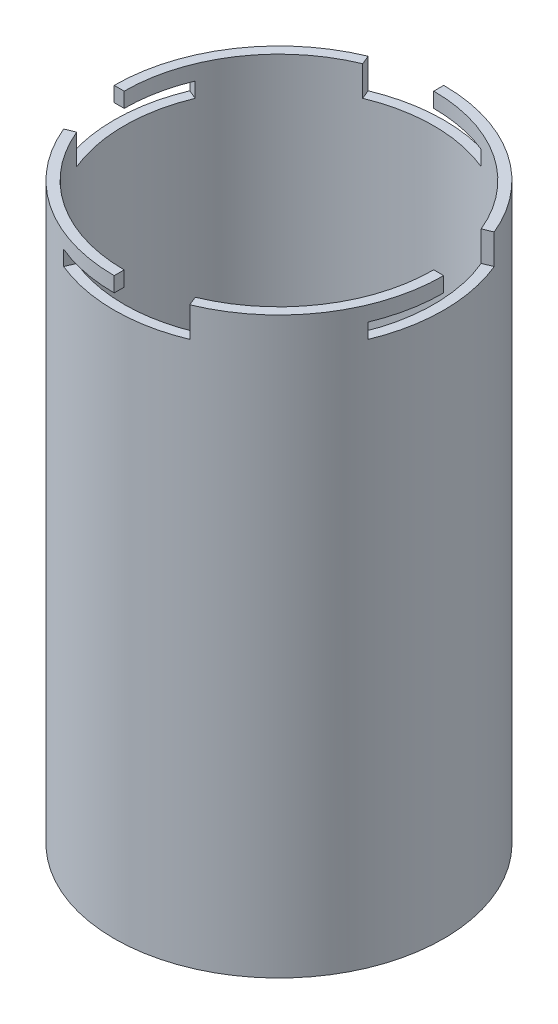
ISO-10303-21;
HEADER;
FILE_DESCRIPTION(('STEP AP214'),'2;1');
FILE_NAME('part.step','',(''),(''),'','','');
FILE_SCHEMA(('AUTOMOTIVE_DESIGN { 1 0 10303 214 1 1 1 1 }'));
ENDSEC;
DATA;
#1=APPLICATION_CONTEXT('core data for automotive mechanical design processes');
#2=APPLICATION_PROTOCOL_DEFINITION('international standard','automotive_design',2000,#1);
#3=PRODUCT_CONTEXT('',#1,'mechanical');
#4=PRODUCT('Part','Part','',(#3));
#5=PRODUCT_RELATED_PRODUCT_CATEGORY('part','',(#4));
#6=PRODUCT_DEFINITION_FORMATION('','',#4);
#7=PRODUCT_DEFINITION_CONTEXT('part definition',#1,'design');
#8=PRODUCT_DEFINITION('design','',#6,#7);
#9=PRODUCT_DEFINITION_SHAPE('','',#8);
#10=(LENGTH_UNIT() NAMED_UNIT(*) SI_UNIT(.MILLI.,.METRE.));
#11=(NAMED_UNIT(*) PLANE_ANGLE_UNIT() SI_UNIT($,.RADIAN.));
#12=(NAMED_UNIT(*) SI_UNIT($,.STERADIAN.) SOLID_ANGLE_UNIT());
#13=UNCERTAINTY_MEASURE_WITH_UNIT(LENGTH_MEASURE(1.E-05),#10,'distance_accuracy_value','');
#14=(GEOMETRIC_REPRESENTATION_CONTEXT(3) GLOBAL_UNCERTAINTY_ASSIGNED_CONTEXT((#13)) GLOBAL_UNIT_ASSIGNED_CONTEXT((#10,
#11,#12)) REPRESENTATION_CONTEXT('',''));
#15=CARTESIAN_POINT('',(0.,0.,0.));
#16=DIRECTION('',(0.,0.,1.));
#17=DIRECTION('',(1.,0.,0.));
#18=AXIS2_PLACEMENT_3D('',#15,#16,#17);
#19=CARTESIAN_POINT('',(0.,115.,0.));
#20=DIRECTION('',(0.,1.,0.));
#21=DIRECTION('',(0.,0.,1.));
#22=AXIS2_PLACEMENT_3D('',#19,#20,#21);
#23=PLANE('',#22);
#24=CARTESIAN_POINT('',(0.,115.,0.));
#25=DIRECTION('',(0.,1.,0.));
#26=DIRECTION('',(0.,0.,1.));
#27=AXIS2_PLACEMENT_3D('',#24,#25,#26);
#28=CIRCLE('',#27,31.);
#29=CARTESIAN_POINT('',(11.8631864033178,115.,28.6402655078499));
#30=VERTEX_POINT('',#29);
#31=CARTESIAN_POINT('',(31.,115.,0.));
#32=VERTEX_POINT('',#31);
#33=EDGE_CURVE('E209',#30,#32,#28,.T.);
#34=ORIENTED_EDGE('',*,*,#33,.F.);
#35=DIRECTION('',(0.38268343236509,0.,0.923879532511287));
#36=VECTOR('',#35,1.);
#37=CARTESIAN_POINT('',(0.,115.,0.));
#38=LINE('',#37,#36);
#39=CARTESIAN_POINT('',(12.628553268048,115.,30.4880245728725));
#40=VERTEX_POINT('',#39);
#41=EDGE_CURVE('E422',#30,#40,#38,.T.);
#42=ORIENTED_EDGE('',*,*,#41,.T.);
#43=CARTESIAN_POINT('',(0.,115.,0.));
#44=DIRECTION('',(0.,1.,0.));
#45=DIRECTION('',(0.,0.,1.));
#46=AXIS2_PLACEMENT_3D('',#43,#44,#45);
#47=CIRCLE('',#46,33.);
#48=CARTESIAN_POINT('',(33.,115.,0.));
#49=VERTEX_POINT('',#48);
#50=EDGE_CURVE('E424',#40,#49,#47,.T.);
#51=ORIENTED_EDGE('',*,*,#50,.T.);
#52=DIRECTION('',(1.,0.,0.));
#53=VECTOR('',#52,1.);
#54=CARTESIAN_POINT('',(0.,115.,0.));
#55=LINE('',#54,#53);
#56=EDGE_CURVE('E428',#32,#49,#55,.T.);
#57=ORIENTED_EDGE('',*,*,#56,.F.);
#58=EDGE_LOOP('',(#34,#42,#51,#57));
#59=FACE_BOUND('',#58,.T.);
#60=ADVANCED_FACE('F35',(#59),#23,.T.);
#61=CARTESIAN_POINT('',(28.6402655078499,115.,-11.8631864033178));
#62=VERTEX_POINT('',#61);
#63=CARTESIAN_POINT('',(0.,115.,-31.));
#64=VERTEX_POINT('',#63);
#65=EDGE_CURVE('E387',#62,#64,#28,.T.);
#66=ORIENTED_EDGE('',*,*,#65,.F.);
#67=DIRECTION('',(0.923879532511287,0.,-0.38268343236509));
#68=VECTOR('',#67,1.);
#69=CARTESIAN_POINT('',(0.,115.,0.));
#70=LINE('',#69,#68);
#71=CARTESIAN_POINT('',(30.4880245728725,115.,-12.628553268048));
#72=VERTEX_POINT('',#71);
#73=EDGE_CURVE('E434',#62,#72,#70,.T.);
#74=ORIENTED_EDGE('',*,*,#73,.T.);
#75=CARTESIAN_POINT('',(0.,115.,0.));
#76=DIRECTION('',(0.,1.,0.));
#77=DIRECTION('',(0.,0.,1.));
#78=AXIS2_PLACEMENT_3D('',#75,#76,#77);
#79=CIRCLE('',#78,33.);
#80=CARTESIAN_POINT('',(0.,115.,-33.));
#81=VERTEX_POINT('',#80);
#82=EDGE_CURVE('E396',#72,#81,#79,.T.);
#83=ORIENTED_EDGE('',*,*,#82,.T.);
#84=DIRECTION('',(0.,0.,1.));
#85=VECTOR('',#84,1.);
#86=CARTESIAN_POINT('',(0.,115.,0.));
#87=LINE('',#86,#85);
#88=EDGE_CURVE('E392',#81,#64,#87,.T.);
#89=ORIENTED_EDGE('',*,*,#88,.T.);
#90=EDGE_LOOP('',(#66,#74,#83,#89));
#91=FACE_BOUND('',#90,.T.);
#92=ADVANCED_FACE('F349',(#91),#23,.T.);
#93=CARTESIAN_POINT('',(-11.8631864033178,115.,-28.6402655078499));
#94=VERTEX_POINT('',#93);
#95=CARTESIAN_POINT('',(-31.,115.,0.));
#96=VERTEX_POINT('',#95);
#97=EDGE_CURVE('E207',#94,#96,#28,.T.);
#98=ORIENTED_EDGE('',*,*,#97,.F.);
#99=DIRECTION('',(-0.38268343236509,0.,-0.923879532511287));
#100=VECTOR('',#99,1.);
#101=CARTESIAN_POINT('',(0.,115.,0.));
#102=LINE('',#101,#100);
#103=CARTESIAN_POINT('',(-12.6285532680479,115.,-30.4880245728725));
#104=VERTEX_POINT('',#103);
#105=EDGE_CURVE('E382',#94,#104,#102,.T.);
#106=ORIENTED_EDGE('',*,*,#105,.T.);
#107=CARTESIAN_POINT('',(0.,115.,0.));
#108=DIRECTION('',(0.,1.,0.));
#109=DIRECTION('',(0.,0.,1.));
#110=AXIS2_PLACEMENT_3D('',#107,#108,#109);
#111=CIRCLE('',#110,33.);
#112=CARTESIAN_POINT('',(-33.,115.,0.));
#113=VERTEX_POINT('',#112);
#114=EDGE_CURVE('E391',#104,#113,#111,.T.);
#115=ORIENTED_EDGE('',*,*,#114,.T.);
#116=DIRECTION('',(1.,0.,0.));
#117=VECTOR('',#116,1.);
#118=CARTESIAN_POINT('',(0.,115.,-2.89792314614694E-13));
#119=LINE('',#118,#117);
#120=EDGE_CURVE('E385',#113,#96,#119,.T.);
#121=ORIENTED_EDGE('',*,*,#120,.T.);
#122=EDGE_LOOP('',(#98,#106,#115,#121));
#123=FACE_BOUND('',#122,.T.);
#124=ADVANCED_FACE('F355',(#123),#23,.T.);
#125=CARTESIAN_POINT('',(0.,109.,0.));
#126=DIRECTION('',(0.,1.,0.));
#127=DIRECTION('',(0.,0.,1.));
#128=AXIS2_PLACEMENT_3D('',#125,#126,#127);
#129=PLANE('',#128);
#130=CARTESIAN_POINT('',(0.,109.,0.));
#131=DIRECTION('',(0.,1.,0.));
#132=DIRECTION('',(0.,0.,1.));
#133=AXIS2_PLACEMENT_3D('',#130,#131,#132);
#134=CIRCLE('',#133,33.);
#135=CARTESIAN_POINT('',(-30.4880245728725,109.,-12.628553268048));
#136=VERTEX_POINT('',#135);
#137=CARTESIAN_POINT('',(-30.4880245728725,109.,12.628553268048));
#138=VERTEX_POINT('',#137);
#139=EDGE_CURVE('E326',#136,#138,#134,.T.);
#140=ORIENTED_EDGE('',*,*,#139,.T.);
#141=DIRECTION('',(0.923879532511287,0.,-0.38268343236509));
#142=VECTOR('',#141,1.);
#143=CARTESIAN_POINT('',(0.,109.,0.));
#144=LINE('',#143,#142);
#145=CARTESIAN_POINT('',(-28.6402655078499,109.,11.8631864033178));
#146=VERTEX_POINT('',#145);
#147=EDGE_CURVE('E282',#138,#146,#144,.T.);
#148=ORIENTED_EDGE('',*,*,#147,.T.);
#149=CARTESIAN_POINT('',(0.,109.,0.));
#150=DIRECTION('',(0.,1.,0.));
#151=DIRECTION('',(0.,0.,1.));
#152=AXIS2_PLACEMENT_3D('',#149,#150,#151);
#153=CIRCLE('',#152,31.);
#154=CARTESIAN_POINT('',(-28.6402655078499,109.,-11.8631864033178));
#155=VERTEX_POINT('',#154);
#156=EDGE_CURVE('E264',#155,#146,#153,.T.);
#157=ORIENTED_EDGE('',*,*,#156,.F.);
#158=DIRECTION('',(0.923879532511287,0.,0.38268343236509));
#159=VECTOR('',#158,1.);
#160=CARTESIAN_POINT('',(0.,109.,0.));
#161=LINE('',#160,#159);
#162=EDGE_CURVE('E279',#136,#155,#161,.T.);
#163=ORIENTED_EDGE('',*,*,#162,.F.);
#164=EDGE_LOOP('',(#140,#148,#157,#163));
#165=FACE_BOUND('',#164,.T.);
#166=ADVANCED_FACE('F345',(#165),#129,.T.);
#167=CARTESIAN_POINT('',(12.628553268048,109.,-30.4880245728725));
#168=VERTEX_POINT('',#167);
#169=CARTESIAN_POINT('',(-12.628553268048,109.,-30.4880245728725));
#170=VERTEX_POINT('',#169);
#171=EDGE_CURVE('E44',#168,#170,#134,.T.);
#172=ORIENTED_EDGE('',*,*,#171,.T.);
#173=DIRECTION('',(0.38268343236509,0.,0.923879532511287));
#174=VECTOR('',#173,1.);
#175=CARTESIAN_POINT('',(0.,109.,0.));
#176=LINE('',#175,#174);
#177=CARTESIAN_POINT('',(-11.8631864033178,109.,-28.6402655078499));
#178=VERTEX_POINT('',#177);
#179=EDGE_CURVE('E276',#170,#178,#176,.T.);
#180=ORIENTED_EDGE('',*,*,#179,.T.);
#181=CARTESIAN_POINT('',(11.8631864033178,109.,-28.6402655078499));
#182=VERTEX_POINT('',#181);
#183=EDGE_CURVE('E275',#182,#178,#153,.T.);
#184=ORIENTED_EDGE('',*,*,#183,.F.);
#185=DIRECTION('',(0.38268343236509,0.,-0.923879532511287));
#186=VECTOR('',#185,1.);
#187=CARTESIAN_POINT('',(0.,109.,0.));
#188=LINE('',#187,#186);
#189=EDGE_CURVE('E273',#182,#168,#188,.T.);
#190=ORIENTED_EDGE('',*,*,#189,.T.);
#191=EDGE_LOOP('',(#172,#180,#184,#190));
#192=FACE_BOUND('',#191,.T.);
#193=ADVANCED_FACE('F376',(#192),#129,.T.);
#194=DIRECTION('',(0.923879532511287,0.,-0.38268343236509));
#195=VECTOR('',#194,1.);
#196=CARTESIAN_POINT('',(0.,109.,0.));
#197=LINE('',#196,#195);
#198=CARTESIAN_POINT('',(28.6402655078499,109.,-11.8631864033178));
#199=VERTEX_POINT('',#198);
#200=CARTESIAN_POINT('',(30.4880245728725,109.,-12.628553268048));
#201=VERTEX_POINT('',#200);
#202=EDGE_CURVE('E270',#199,#201,#197,.T.);
#203=ORIENTED_EDGE('',*,*,#202,.F.);
#204=CARTESIAN_POINT('',(28.6402655078499,109.,11.8631864033178));
#205=VERTEX_POINT('',#204);
#206=EDGE_CURVE('E265',#205,#199,#153,.T.);
#207=ORIENTED_EDGE('',*,*,#206,.F.);
#208=DIRECTION('',(0.923879532511287,0.,0.38268343236509));
#209=VECTOR('',#208,1.);
#210=CARTESIAN_POINT('',(0.,109.,0.));
#211=LINE('',#210,#209);
#212=CARTESIAN_POINT('',(30.4880245728725,109.,12.628553268048));
#213=VERTEX_POINT('',#212);
#214=EDGE_CURVE('E268',#205,#213,#211,.T.);
#215=ORIENTED_EDGE('',*,*,#214,.T.);
#216=EDGE_CURVE('E11',#213,#201,#134,.T.);
#217=ORIENTED_EDGE('',*,*,#216,.T.);
#218=EDGE_LOOP('',(#203,#207,#215,#217));
#219=FACE_BOUND('',#218,.T.);
#220=ADVANCED_FACE('F346',(#219),#129,.T.);
#221=CARTESIAN_POINT('',(0.,109.,0.));
#222=DIRECTION('',(0.,-1.,0.));
#223=DIRECTION('',(0.,0.,-1.));
#224=AXIS2_PLACEMENT_3D('',#221,#222,#223);
#225=CYLINDRICAL_SURFACE('',#224,33.);
#226=ORIENTED_EDGE('',*,*,#216,.F.);
#227=DIRECTION('',(0.,-1.,0.));
#228=VECTOR('',#227,1.);
#229=CARTESIAN_POINT('',(30.4880245728725,112.,12.628553268048));
#230=LINE('',#229,#228);
#231=CARTESIAN_POINT('',(30.4880245728725,112.,12.628553268048));
#232=VERTEX_POINT('',#231);
#233=EDGE_CURVE('E318',#232,#213,#230,.T.);
#234=ORIENTED_EDGE('',*,*,#233,.F.);
#235=CARTESIAN_POINT('',(0.,112.,0.));
#236=DIRECTION('',(0.,1.,0.));
#237=DIRECTION('',(0.,0.,1.));
#238=AXIS2_PLACEMENT_3D('',#235,#236,#237);
#239=CIRCLE('',#238,33.);
#240=CARTESIAN_POINT('',(33.,112.,0.));
#241=VERTEX_POINT('',#240);
#242=EDGE_CURVE('E404',#232,#241,#239,.T.);
#243=ORIENTED_EDGE('',*,*,#242,.T.);
#244=DIRECTION('',(0.,-1.,0.));
#245=VECTOR('',#244,1.);
#246=CARTESIAN_POINT('',(33.,115.,0.));
#247=LINE('',#246,#245);
#248=EDGE_CURVE('E240',#49,#241,#247,.T.);
#249=ORIENTED_EDGE('',*,*,#248,.F.);
#250=ORIENTED_EDGE('',*,*,#50,.F.);
#251=DIRECTION('',(0.,-1.,0.));
#252=VECTOR('',#251,1.);
#253=CARTESIAN_POINT('',(12.628553268048,112.,30.4880245728725));
#254=LINE('',#253,#252);
#255=CARTESIAN_POINT('',(12.628553268048,109.,30.4880245728725));
#256=VERTEX_POINT('',#255);
#257=EDGE_CURVE('E321',#40,#256,#254,.T.);
#258=ORIENTED_EDGE('',*,*,#257,.T.);
#259=CARTESIAN_POINT('',(-12.628553268048,109.,30.4880245728725));
#260=VERTEX_POINT('',#259);
#261=EDGE_CURVE('E45',#260,#256,#134,.T.);
#262=ORIENTED_EDGE('',*,*,#261,.F.);
#263=DIRECTION('',(0.,-1.,0.));
#264=VECTOR('',#263,1.);
#265=CARTESIAN_POINT('',(-12.628553268048,112.,30.4880245728725));
#266=LINE('',#265,#264);
#267=CARTESIAN_POINT('',(-12.628553268048,112.,30.4880245728725));
#268=VERTEX_POINT('',#267);
#269=EDGE_CURVE('E287',#268,#260,#266,.T.);
#270=ORIENTED_EDGE('',*,*,#269,.F.);
#271=CARTESIAN_POINT('',(0.,112.,0.));
#272=DIRECTION('',(0.,1.,0.));
#273=DIRECTION('',(0.,0.,1.));
#274=AXIS2_PLACEMENT_3D('',#271,#272,#273);
#275=CIRCLE('',#274,33.);
#276=CARTESIAN_POINT('',(0.,112.,33.));
#277=VERTEX_POINT('',#276);
#278=EDGE_CURVE('E419',#268,#277,#275,.T.);
#279=ORIENTED_EDGE('',*,*,#278,.T.);
#280=DIRECTION('',(0.,-1.,0.));
#281=VECTOR('',#280,1.);
#282=CARTESIAN_POINT('',(0.,115.,33.));
#283=LINE('',#282,#281);
#284=CARTESIAN_POINT('',(0.,115.,33.));
#285=VERTEX_POINT('',#284);
#286=EDGE_CURVE('E223',#285,#277,#283,.T.);
#287=ORIENTED_EDGE('',*,*,#286,.F.);
#288=CARTESIAN_POINT('',(0.,115.,0.));
#289=DIRECTION('',(0.,1.,0.));
#290=DIRECTION('',(0.,0.,1.));
#291=AXIS2_PLACEMENT_3D('',#288,#289,#290);
#292=CIRCLE('',#291,33.);
#293=CARTESIAN_POINT('',(-30.4880245728725,115.,12.628553268048));
#294=VERTEX_POINT('',#293);
#295=EDGE_CURVE('E214',#294,#285,#292,.T.);
#296=ORIENTED_EDGE('',*,*,#295,.F.);
#297=DIRECTION('',(0.,-1.,0.));
#298=VECTOR('',#297,1.);
#299=CARTESIAN_POINT('',(-30.4880245728725,112.,12.628553268048));
#300=LINE('',#299,#298);
#301=EDGE_CURVE('E290',#294,#138,#300,.T.);
#302=ORIENTED_EDGE('',*,*,#301,.T.);
#303=ORIENTED_EDGE('',*,*,#139,.F.);
#304=DIRECTION('',(0.,-1.,0.));
#305=VECTOR('',#304,1.);
#306=CARTESIAN_POINT('',(-30.4880245728725,112.,-12.628553268048));
#307=LINE('',#306,#305);
#308=CARTESIAN_POINT('',(-30.4880245728725,112.,-12.628553268048));
#309=VERTEX_POINT('',#308);
#310=EDGE_CURVE('E296',#309,#136,#307,.T.);
#311=ORIENTED_EDGE('',*,*,#310,.F.);
#312=CARTESIAN_POINT('',(0.,112.,0.));
#313=DIRECTION('',(0.,1.,0.));
#314=DIRECTION('',(0.,0.,1.));
#315=AXIS2_PLACEMENT_3D('',#312,#313,#314);
#316=CIRCLE('',#315,33.);
#317=CARTESIAN_POINT('',(-33.,112.,0.));
#318=VERTEX_POINT('',#317);
#319=EDGE_CURVE('E415',#309,#318,#316,.T.);
#320=ORIENTED_EDGE('',*,*,#319,.T.);
#321=DIRECTION('',(0.,-1.,0.));
#322=VECTOR('',#321,1.);
#323=CARTESIAN_POINT('',(-33.,115.,0.));
#324=LINE('',#323,#322);
#325=EDGE_CURVE('E231',#113,#318,#324,.T.);
#326=ORIENTED_EDGE('',*,*,#325,.F.);
#327=ORIENTED_EDGE('',*,*,#114,.F.);
#328=DIRECTION('',(0.,-1.,0.));
#329=VECTOR('',#328,1.);
#330=CARTESIAN_POINT('',(-12.628553268048,112.,-30.4880245728725));
#331=LINE('',#330,#329);
#332=EDGE_CURVE('E299',#104,#170,#331,.T.);
#333=ORIENTED_EDGE('',*,*,#332,.T.);
#334=ORIENTED_EDGE('',*,*,#171,.F.);
#335=DIRECTION('',(0.,-1.,0.));
#336=VECTOR('',#335,1.);
#337=CARTESIAN_POINT('',(12.628553268048,112.,-30.4880245728725));
#338=LINE('',#337,#336);
#339=CARTESIAN_POINT('',(12.628553268048,112.,-30.4880245728725));
#340=VERTEX_POINT('',#339);
#341=EDGE_CURVE('E307',#340,#168,#338,.T.);
#342=ORIENTED_EDGE('',*,*,#341,.F.);
#343=CARTESIAN_POINT('',(0.,112.,0.));
#344=DIRECTION('',(0.,1.,0.));
#345=DIRECTION('',(0.,0.,1.));
#346=AXIS2_PLACEMENT_3D('',#343,#344,#345);
#347=CIRCLE('',#346,33.);
#348=CARTESIAN_POINT('',(0.,112.,-33.));
#349=VERTEX_POINT('',#348);
#350=EDGE_CURVE('E410',#340,#349,#347,.T.);
#351=ORIENTED_EDGE('',*,*,#350,.T.);
#352=DIRECTION('',(0.,-1.,0.));
#353=VECTOR('',#352,1.);
#354=CARTESIAN_POINT('',(0.,115.,-33.));
#355=LINE('',#354,#353);
#356=EDGE_CURVE('E235',#81,#349,#355,.T.);
#357=ORIENTED_EDGE('',*,*,#356,.F.);
#358=ORIENTED_EDGE('',*,*,#82,.F.);
#359=DIRECTION('',(0.,-1.,0.));
#360=VECTOR('',#359,1.);
#361=CARTESIAN_POINT('',(30.4880245728725,112.,-12.628553268048));
#362=LINE('',#361,#360);
#363=EDGE_CURVE('E310',#72,#201,#362,.T.);
#364=ORIENTED_EDGE('',*,*,#363,.T.);
#365=EDGE_LOOP('',(#226,#234,#243,#249,#250,#258,#262,#270,#279,#287,#296,#302,#303,#311,#320,
#326,#327,#333,#334,#342,#351,#357,#358,#364));
#366=FACE_BOUND('',#365,.T.);
#367=CARTESIAN_POINT('',(0.,0.,0.));
#368=DIRECTION('',(0.,1.,0.));
#369=DIRECTION('',(0.,0.,1.));
#370=AXIS2_PLACEMENT_3D('',#367,#368,#369);
#371=CIRCLE('',#370,33.);
#372=CARTESIAN_POINT('',(0.,0.,33.));
#373=VERTEX_POINT('',#372);
#374=EDGE_CURVE('E39',#373,#373,#371,.T.);
#375=ORIENTED_EDGE('',*,*,#374,.T.);
#376=EDGE_LOOP('',(#375));
#377=FACE_BOUND('',#376,.T.);
#378=ADVANCED_FACE('F37',(#366,#377),#225,.T.);
#379=DIRECTION('',(0.38268343236509,0.,-0.923879532511287));
#380=VECTOR('',#379,1.);
#381=CARTESIAN_POINT('',(0.,109.,0.));
#382=LINE('',#381,#380);
#383=CARTESIAN_POINT('',(-11.8631864033178,109.,28.6402655078499));
#384=VERTEX_POINT('',#383);
#385=EDGE_CURVE('E60',#260,#384,#382,.T.);
#386=ORIENTED_EDGE('',*,*,#385,.F.);
#387=ORIENTED_EDGE('',*,*,#261,.T.);
#388=DIRECTION('',(0.38268343236509,0.,0.923879532511287));
#389=VECTOR('',#388,1.);
#390=CARTESIAN_POINT('',(0.,109.,0.));
#391=LINE('',#390,#389);
#392=CARTESIAN_POINT('',(11.8631864033178,109.,28.6402655078499));
#393=VERTEX_POINT('',#392);
#394=EDGE_CURVE('E263',#393,#256,#391,.T.);
#395=ORIENTED_EDGE('',*,*,#394,.F.);
#396=EDGE_CURVE('E243',#384,#393,#153,.T.);
#397=ORIENTED_EDGE('',*,*,#396,.F.);
#398=EDGE_LOOP('',(#386,#387,#395,#397));
#399=FACE_BOUND('',#398,.T.);
#400=ADVANCED_FACE('F335',(#399),#129,.T.);
#401=CARTESIAN_POINT('',(0.,0.,0.));
#402=DIRECTION('',(0.,1.,0.));
#403=DIRECTION('',(0.,0.,1.));
#404=AXIS2_PLACEMENT_3D('',#401,#402,#403);
#405=PLANE('',#404);
#406=CARTESIAN_POINT('',(0.,0.,0.));
#407=DIRECTION('',(0.,1.,0.));
#408=DIRECTION('',(0.,0.,1.));
#409=AXIS2_PLACEMENT_3D('',#406,#407,#408);
#410=CIRCLE('',#409,31.);
#411=CARTESIAN_POINT('',(0.,0.,31.));
#412=VERTEX_POINT('',#411);
#413=EDGE_CURVE('E407',#412,#412,#410,.T.);
#414=ORIENTED_EDGE('',*,*,#413,.T.);
#415=EDGE_LOOP('',(#414));
#416=FACE_BOUND('',#415,.T.);
#417=ORIENTED_EDGE('',*,*,#374,.F.);
#418=EDGE_LOOP('',(#417));
#419=FACE_BOUND('',#418,.T.);
#420=ADVANCED_FACE('F332',(#416,#419),#405,.F.);
#421=CARTESIAN_POINT('',(0.,112.,0.));
#422=DIRECTION('',(0.923879532511286,0.,-0.38268343236509));
#423=DIRECTION('',(-0.38268343236509,0.,-0.923879532511287));
#424=AXIS2_PLACEMENT_3D('',#421,#422,#423);
#425=PLANE('',#424);
#426=ORIENTED_EDGE('',*,*,#394,.T.);
#427=ORIENTED_EDGE('',*,*,#257,.F.);
#428=ORIENTED_EDGE('',*,*,#41,.F.);
#429=DIRECTION('',(0.,-1.,0.));
#430=VECTOR('',#429,1.);
#431=CARTESIAN_POINT('',(11.8631864033178,112.,28.6402655078499));
#432=LINE('',#431,#430);
#433=EDGE_CURVE('E324',#30,#393,#432,.T.);
#434=ORIENTED_EDGE('',*,*,#433,.T.);
#435=EDGE_LOOP('',(#426,#427,#428,#434));
#436=FACE_BOUND('',#435,.T.);
#437=ADVANCED_FACE('F334',(#436),#425,.F.);
#438=CARTESIAN_POINT('',(0.,112.,0.));
#439=DIRECTION('',(0.38268343236509,0.,-0.923879532511286));
#440=DIRECTION('',(-0.923879532511287,0.,-0.38268343236509));
#441=AXIS2_PLACEMENT_3D('',#438,#439,#440);
#442=PLANE('',#441);
#443=ORIENTED_EDGE('',*,*,#214,.F.);
#444=DIRECTION('',(0.,-1.,0.));
#445=VECTOR('',#444,1.);
#446=CARTESIAN_POINT('',(28.6402655078499,112.,11.8631864033178));
#447=LINE('',#446,#445);
#448=CARTESIAN_POINT('',(28.6402655078499,112.,11.8631864033178));
#449=VERTEX_POINT('',#448);
#450=EDGE_CURVE('E316',#449,#205,#447,.T.);
#451=ORIENTED_EDGE('',*,*,#450,.F.);
#452=DIRECTION('',(0.923879532511287,0.,0.38268343236509));
#453=VECTOR('',#452,1.);
#454=CARTESIAN_POINT('',(0.,112.,0.));
#455=LINE('',#454,#453);
#456=EDGE_CURVE('E246',#449,#232,#455,.T.);
#457=ORIENTED_EDGE('',*,*,#456,.T.);
#458=ORIENTED_EDGE('',*,*,#233,.T.);
#459=EDGE_LOOP('',(#443,#451,#457,#458));
#460=FACE_BOUND('',#459,.T.);
#461=ADVANCED_FACE('F341',(#460),#442,.T.);
#462=CARTESIAN_POINT('',(0.,112.,0.));
#463=DIRECTION('',(-0.38268343236509,0.,-0.923879532511287));
#464=DIRECTION('',(-0.923879532511287,0.,0.38268343236509));
#465=AXIS2_PLACEMENT_3D('',#462,#463,#464);
#466=PLANE('',#465);
#467=ORIENTED_EDGE('',*,*,#202,.T.);
#468=ORIENTED_EDGE('',*,*,#363,.F.);
#469=ORIENTED_EDGE('',*,*,#73,.F.);
#470=DIRECTION('',(0.,-1.,0.));
#471=VECTOR('',#470,1.);
#472=CARTESIAN_POINT('',(28.6402655078499,112.,-11.8631864033178));
#473=LINE('',#472,#471);
#474=EDGE_CURVE('E313',#62,#199,#473,.T.);
#475=ORIENTED_EDGE('',*,*,#474,.T.);
#476=EDGE_LOOP('',(#467,#468,#469,#475));
#477=FACE_BOUND('',#476,.T.);
#478=ADVANCED_FACE('F470',(#477),#466,.F.);
#479=CARTESIAN_POINT('',(0.,112.,0.));
#480=DIRECTION('',(-0.923879532511287,0.,-0.38268343236509));
#481=DIRECTION('',(-0.38268343236509,0.,0.923879532511287));
#482=AXIS2_PLACEMENT_3D('',#479,#480,#481);
#483=PLANE('',#482);
#484=ORIENTED_EDGE('',*,*,#189,.F.);
#485=DIRECTION('',(0.,-1.,0.));
#486=VECTOR('',#485,1.);
#487=CARTESIAN_POINT('',(11.8631864033178,112.,-28.6402655078499));
#488=LINE('',#487,#486);
#489=CARTESIAN_POINT('',(11.8631864033178,112.,-28.6402655078499));
#490=VERTEX_POINT('',#489);
#491=EDGE_CURVE('E305',#490,#182,#488,.T.);
#492=ORIENTED_EDGE('',*,*,#491,.F.);
#493=DIRECTION('',(0.38268343236509,0.,-0.923879532511287));
#494=VECTOR('',#493,1.);
#495=CARTESIAN_POINT('',(0.,112.,0.));
#496=LINE('',#495,#494);
#497=EDGE_CURVE('E251',#490,#340,#496,.T.);
#498=ORIENTED_EDGE('',*,*,#497,.T.);
#499=ORIENTED_EDGE('',*,*,#341,.T.);
#500=EDGE_LOOP('',(#484,#492,#498,#499));
#501=FACE_BOUND('',#500,.T.);
#502=ADVANCED_FACE('F507',(#501),#483,.T.);
#503=CARTESIAN_POINT('',(0.,112.,0.));
#504=DIRECTION('',(0.923879532511287,0.,-0.38268343236509));
#505=DIRECTION('',(-0.38268343236509,0.,-0.923879532511287));
#506=AXIS2_PLACEMENT_3D('',#503,#504,#505);
#507=PLANE('',#506);
#508=ORIENTED_EDGE('',*,*,#179,.F.);
#509=ORIENTED_EDGE('',*,*,#332,.F.);
#510=ORIENTED_EDGE('',*,*,#105,.F.);
#511=DIRECTION('',(0.,-1.,0.));
#512=VECTOR('',#511,1.);
#513=CARTESIAN_POINT('',(-11.8631864033178,112.,-28.6402655078499));
#514=LINE('',#513,#512);
#515=EDGE_CURVE('E302',#94,#178,#514,.T.);
#516=ORIENTED_EDGE('',*,*,#515,.T.);
#517=EDGE_LOOP('',(#508,#509,#510,#516));
#518=FACE_BOUND('',#517,.T.);
#519=ADVANCED_FACE('F390',(#518),#507,.T.);
#520=CARTESIAN_POINT('',(0.,112.,0.));
#521=DIRECTION('',(0.38268343236509,0.,-0.923879532511287));
#522=DIRECTION('',(-0.923879532511287,0.,-0.38268343236509));
#523=AXIS2_PLACEMENT_3D('',#520,#521,#522);
#524=PLANE('',#523);
#525=ORIENTED_EDGE('',*,*,#162,.T.);
#526=DIRECTION('',(0.,-1.,0.));
#527=VECTOR('',#526,1.);
#528=CARTESIAN_POINT('',(-28.6402655078499,112.,-11.8631864033178));
#529=LINE('',#528,#527);
#530=CARTESIAN_POINT('',(-28.6402655078499,112.,-11.8631864033178));
#531=VERTEX_POINT('',#530);
#532=EDGE_CURVE('E294',#531,#155,#529,.T.);
#533=ORIENTED_EDGE('',*,*,#532,.F.);
#534=DIRECTION('',(0.923879532511287,0.,0.38268343236509));
#535=VECTOR('',#534,1.);
#536=CARTESIAN_POINT('',(0.,112.,0.));
#537=LINE('',#536,#535);
#538=EDGE_CURVE('E255',#309,#531,#537,.T.);
#539=ORIENTED_EDGE('',*,*,#538,.F.);
#540=ORIENTED_EDGE('',*,*,#310,.T.);
#541=EDGE_LOOP('',(#525,#533,#539,#540));
#542=FACE_BOUND('',#541,.T.);
#543=ADVANCED_FACE('F460',(#542),#524,.F.);
#544=CARTESIAN_POINT('',(0.,112.,0.));
#545=DIRECTION('',(-0.38268343236509,0.,-0.923879532511287));
#546=DIRECTION('',(-0.923879532511287,0.,0.38268343236509));
#547=AXIS2_PLACEMENT_3D('',#544,#545,#546);
#548=PLANE('',#547);
#549=ORIENTED_EDGE('',*,*,#147,.F.);
#550=ORIENTED_EDGE('',*,*,#301,.F.);
#551=DIRECTION('',(-0.923879532511287,0.,0.38268343236509));
#552=VECTOR('',#551,1.);
#553=CARTESIAN_POINT('',(0.,115.,0.));
#554=LINE('',#553,#552);
#555=CARTESIAN_POINT('',(-28.6402655078499,115.,11.8631864033178));
#556=VERTEX_POINT('',#555);
#557=EDGE_CURVE('E401',#556,#294,#554,.T.);
#558=ORIENTED_EDGE('',*,*,#557,.F.);
#559=DIRECTION('',(0.,-1.,0.));
#560=VECTOR('',#559,1.);
#561=CARTESIAN_POINT('',(-28.6402655078499,112.,11.8631864033178));
#562=LINE('',#561,#560);
#563=EDGE_CURVE('E203',#556,#146,#562,.T.);
#564=ORIENTED_EDGE('',*,*,#563,.T.);
#565=EDGE_LOOP('',(#549,#550,#558,#564));
#566=FACE_BOUND('',#565,.T.);
#567=ADVANCED_FACE('F499',(#566),#548,.T.);
#568=CARTESIAN_POINT('',(0.,112.,0.));
#569=DIRECTION('',(-0.923879532511287,0.,-0.38268343236509));
#570=DIRECTION('',(-0.38268343236509,0.,0.923879532511287));
#571=AXIS2_PLACEMENT_3D('',#568,#569,#570);
#572=PLANE('',#571);
#573=ORIENTED_EDGE('',*,*,#385,.T.);
#574=DIRECTION('',(0.,-1.,0.));
#575=VECTOR('',#574,1.);
#576=CARTESIAN_POINT('',(-11.8631864033178,112.,28.6402655078499));
#577=LINE('',#576,#575);
#578=CARTESIAN_POINT('',(-11.8631864033178,112.,28.6402655078499));
#579=VERTEX_POINT('',#578);
#580=EDGE_CURVE('E261',#579,#384,#577,.T.);
#581=ORIENTED_EDGE('',*,*,#580,.F.);
#582=DIRECTION('',(0.38268343236509,0.,-0.923879532511287));
#583=VECTOR('',#582,1.);
#584=CARTESIAN_POINT('',(0.,112.,0.));
#585=LINE('',#584,#583);
#586=EDGE_CURVE('E258',#268,#579,#585,.T.);
#587=ORIENTED_EDGE('',*,*,#586,.F.);
#588=ORIENTED_EDGE('',*,*,#269,.T.);
#589=EDGE_LOOP('',(#573,#581,#587,#588));
#590=FACE_BOUND('',#589,.T.);
#591=ADVANCED_FACE('F483',(#590),#572,.F.);
#592=CARTESIAN_POINT('',(0.,112.,0.));
#593=DIRECTION('',(0.,1.,0.));
#594=DIRECTION('',(0.,0.,1.));
#595=AXIS2_PLACEMENT_3D('',#592,#593,#594);
#596=PLANE('',#595);
#597=ORIENTED_EDGE('',*,*,#456,.F.);
#598=CARTESIAN_POINT('',(0.,112.,0.));
#599=DIRECTION('',(0.,1.,0.));
#600=DIRECTION('',(0.,0.,1.));
#601=AXIS2_PLACEMENT_3D('',#598,#599,#600);
#602=CIRCLE('',#601,31.);
#603=CARTESIAN_POINT('',(31.,112.,0.));
#604=VERTEX_POINT('',#603);
#605=EDGE_CURVE('E248',#449,#604,#602,.T.);
#606=ORIENTED_EDGE('',*,*,#605,.T.);
#607=DIRECTION('',(1.,0.,0.));
#608=VECTOR('',#607,1.);
#609=CARTESIAN_POINT('',(0.,112.,0.));
#610=LINE('',#609,#608);
#611=EDGE_CURVE('E406',#604,#241,#610,.T.);
#612=ORIENTED_EDGE('',*,*,#611,.T.);
#613=ORIENTED_EDGE('',*,*,#242,.F.);
#614=EDGE_LOOP('',(#597,#606,#612,#613));
#615=FACE_BOUND('',#614,.T.);
#616=ADVANCED_FACE('F367',(#615),#596,.F.);
#617=ORIENTED_EDGE('',*,*,#319,.F.);
#618=ORIENTED_EDGE('',*,*,#538,.T.);
#619=CARTESIAN_POINT('',(-31.,112.,0.));
#620=VERTEX_POINT('',#619);
#621=EDGE_CURVE('E247',#531,#620,#602,.T.);
#622=ORIENTED_EDGE('',*,*,#621,.T.);
#623=DIRECTION('',(1.,0.,0.));
#624=VECTOR('',#623,1.);
#625=CARTESIAN_POINT('',(0.,112.,-2.89792314614694E-13));
#626=LINE('',#625,#624);
#627=EDGE_CURVE('E417',#318,#620,#626,.T.);
#628=ORIENTED_EDGE('',*,*,#627,.F.);
#629=EDGE_LOOP('',(#617,#618,#622,#628));
#630=FACE_BOUND('',#629,.T.);
#631=ADVANCED_FACE('F453',(#630),#596,.F.);
#632=ORIENTED_EDGE('',*,*,#586,.T.);
#633=CARTESIAN_POINT('',(0.,112.,31.));
#634=VERTEX_POINT('',#633);
#635=EDGE_CURVE('E244',#579,#634,#602,.T.);
#636=ORIENTED_EDGE('',*,*,#635,.T.);
#637=DIRECTION('',(0.,0.,-1.));
#638=VECTOR('',#637,1.);
#639=CARTESIAN_POINT('',(0.,112.,0.));
#640=LINE('',#639,#638);
#641=EDGE_CURVE('E222',#277,#634,#640,.T.);
#642=ORIENTED_EDGE('',*,*,#641,.F.);
#643=ORIENTED_EDGE('',*,*,#278,.F.);
#644=EDGE_LOOP('',(#632,#636,#642,#643));
#645=FACE_BOUND('',#644,.T.);
#646=ADVANCED_FACE('F368',(#645),#596,.F.);
#647=CARTESIAN_POINT('',(0.,115.,0.));
#648=DIRECTION('',(0.,0.,-1.));
#649=DIRECTION('',(-1.,0.,0.));
#650=AXIS2_PLACEMENT_3D('',#647,#648,#649);
#651=PLANE('',#650);
#652=ORIENTED_EDGE('',*,*,#611,.F.);
#653=DIRECTION('',(0.,-1.,0.));
#654=VECTOR('',#653,1.);
#655=CARTESIAN_POINT('',(31.,115.,0.));
#656=LINE('',#655,#654);
#657=EDGE_CURVE('E238',#32,#604,#656,.T.);
#658=ORIENTED_EDGE('',*,*,#657,.F.);
#659=ORIENTED_EDGE('',*,*,#56,.T.);
#660=ORIENTED_EDGE('',*,*,#248,.T.);
#661=EDGE_LOOP('',(#652,#658,#659,#660));
#662=FACE_BOUND('',#661,.T.);
#663=ADVANCED_FACE('F478',(#662),#651,.T.);
#664=CARTESIAN_POINT('',(0.,115.,0.));
#665=DIRECTION('',(1.,0.,0.));
#666=DIRECTION('',(0.,0.,-1.));
#667=AXIS2_PLACEMENT_3D('',#664,#665,#666);
#668=PLANE('',#667);
#669=DIRECTION('',(0.,0.,1.));
#670=VECTOR('',#669,1.);
#671=CARTESIAN_POINT('',(0.,112.,0.));
#672=LINE('',#671,#670);
#673=CARTESIAN_POINT('',(0.,112.,-31.));
#674=VERTEX_POINT('',#673);
#675=EDGE_CURVE('E412',#349,#674,#672,.T.);
#676=ORIENTED_EDGE('',*,*,#675,.T.);
#677=DIRECTION('',(0.,-1.,0.));
#678=VECTOR('',#677,1.);
#679=CARTESIAN_POINT('',(0.,115.,-31.));
#680=LINE('',#679,#678);
#681=EDGE_CURVE('E52',#64,#674,#680,.T.);
#682=ORIENTED_EDGE('',*,*,#681,.F.);
#683=ORIENTED_EDGE('',*,*,#88,.F.);
#684=ORIENTED_EDGE('',*,*,#356,.T.);
#685=EDGE_LOOP('',(#676,#682,#683,#684));
#686=FACE_BOUND('',#685,.T.);
#687=ADVANCED_FACE('F445',(#686),#668,.F.);
#688=CARTESIAN_POINT('',(0.,115.,-2.89792314614694E-13));
#689=DIRECTION('',(0.,0.,-1.));
#690=DIRECTION('',(-1.,0.,0.));
#691=AXIS2_PLACEMENT_3D('',#688,#689,#690);
#692=PLANE('',#691);
#693=ORIENTED_EDGE('',*,*,#627,.T.);
#694=DIRECTION('',(0.,-1.,0.));
#695=VECTOR('',#694,1.);
#696=CARTESIAN_POINT('',(-31.,115.,0.));
#697=LINE('',#696,#695);
#698=EDGE_CURVE('E225',#96,#620,#697,.T.);
#699=ORIENTED_EDGE('',*,*,#698,.F.);
#700=ORIENTED_EDGE('',*,*,#120,.F.);
#701=ORIENTED_EDGE('',*,*,#325,.T.);
#702=EDGE_LOOP('',(#693,#699,#700,#701));
#703=FACE_BOUND('',#702,.T.);
#704=ADVANCED_FACE('F369',(#703),#692,.F.);
#705=CARTESIAN_POINT('',(0.,115.,0.));
#706=DIRECTION('',(-1.,0.,0.));
#707=DIRECTION('',(0.,0.,1.));
#708=AXIS2_PLACEMENT_3D('',#705,#706,#707);
#709=PLANE('',#708);
#710=ORIENTED_EDGE('',*,*,#641,.T.);
#711=DIRECTION('',(0.,-1.,0.));
#712=VECTOR('',#711,1.);
#713=CARTESIAN_POINT('',(0.,115.,31.));
#714=LINE('',#713,#712);
#715=CARTESIAN_POINT('',(0.,115.,31.));
#716=VERTEX_POINT('',#715);
#717=EDGE_CURVE('E200',#716,#634,#714,.T.);
#718=ORIENTED_EDGE('',*,*,#717,.F.);
#719=DIRECTION('',(0.,0.,-1.));
#720=VECTOR('',#719,1.);
#721=CARTESIAN_POINT('',(0.,115.,0.));
#722=LINE('',#721,#720);
#723=EDGE_CURVE('E211',#285,#716,#722,.T.);
#724=ORIENTED_EDGE('',*,*,#723,.F.);
#725=ORIENTED_EDGE('',*,*,#286,.T.);
#726=EDGE_LOOP('',(#710,#718,#724,#725));
#727=FACE_BOUND('',#726,.T.);
#728=ADVANCED_FACE('F220',(#727),#709,.F.);
#729=EDGE_CURVE('E196',#556,#716,#28,.T.);
#730=ORIENTED_EDGE('',*,*,#729,.F.);
#731=ORIENTED_EDGE('',*,*,#557,.T.);
#732=ORIENTED_EDGE('',*,*,#295,.T.);
#733=ORIENTED_EDGE('',*,*,#723,.T.);
#734=EDGE_LOOP('',(#730,#731,#732,#733));
#735=FACE_BOUND('',#734,.T.);
#736=ADVANCED_FACE('F212',(#735),#23,.T.);
#737=ORIENTED_EDGE('',*,*,#497,.F.);
#738=EDGE_CURVE('E254',#490,#674,#602,.T.);
#739=ORIENTED_EDGE('',*,*,#738,.T.);
#740=ORIENTED_EDGE('',*,*,#675,.F.);
#741=ORIENTED_EDGE('',*,*,#350,.F.);
#742=EDGE_LOOP('',(#737,#739,#740,#741));
#743=FACE_BOUND('',#742,.T.);
#744=ADVANCED_FACE('F361',(#743),#596,.F.);
#745=CARTESIAN_POINT('',(0.,0.,0.));
#746=DIRECTION('',(0.,1.,0.));
#747=DIRECTION('',(0.,0.,1.));
#748=AXIS2_PLACEMENT_3D('',#745,#746,#747);
#749=CYLINDRICAL_SURFACE('',#748,31.);
#750=ORIENTED_EDGE('',*,*,#413,.F.);
#751=EDGE_LOOP('',(#750));
#752=FACE_BOUND('',#751,.T.);
#753=ORIENTED_EDGE('',*,*,#65,.T.);
#754=ORIENTED_EDGE('',*,*,#681,.T.);
#755=ORIENTED_EDGE('',*,*,#738,.F.);
#756=ORIENTED_EDGE('',*,*,#491,.T.);
#757=ORIENTED_EDGE('',*,*,#183,.T.);
#758=ORIENTED_EDGE('',*,*,#515,.F.);
#759=ORIENTED_EDGE('',*,*,#97,.T.);
#760=ORIENTED_EDGE('',*,*,#698,.T.);
#761=ORIENTED_EDGE('',*,*,#621,.F.);
#762=ORIENTED_EDGE('',*,*,#532,.T.);
#763=ORIENTED_EDGE('',*,*,#156,.T.);
#764=ORIENTED_EDGE('',*,*,#563,.F.);
#765=ORIENTED_EDGE('',*,*,#729,.T.);
#766=ORIENTED_EDGE('',*,*,#717,.T.);
#767=ORIENTED_EDGE('',*,*,#635,.F.);
#768=ORIENTED_EDGE('',*,*,#580,.T.);
#769=ORIENTED_EDGE('',*,*,#396,.T.);
#770=ORIENTED_EDGE('',*,*,#433,.F.);
#771=ORIENTED_EDGE('',*,*,#33,.T.);
#772=ORIENTED_EDGE('',*,*,#657,.T.);
#773=ORIENTED_EDGE('',*,*,#605,.F.);
#774=ORIENTED_EDGE('',*,*,#450,.T.);
#775=ORIENTED_EDGE('',*,*,#206,.T.);
#776=ORIENTED_EDGE('',*,*,#474,.F.);
#777=EDGE_LOOP('',(#753,#754,#755,#756,#757,#758,#759,#760,#761,#762,#763,#764,#765,#766,#767,
#768,#769,#770,#771,#772,#773,#774,#775,#776));
#778=FACE_BOUND('',#777,.T.);
#779=ADVANCED_FACE('F198',(#752,#778),#749,.F.);
#780=CLOSED_SHELL('',(#60,#92,#124,#166,#193,#220,#378,#400,#420,#437,#461,#478,#502,#519,#543,
#567,#591,#616,#631,#646,#663,#687,#704,#728,#736,#744,#779));
#781=MANIFOLD_SOLID_BREP('B2',#780);
#782=ADVANCED_BREP_SHAPE_REPRESENTATION('',(#18,#781),#14);
#783=SHAPE_DEFINITION_REPRESENTATION(#9,#782);
ENDSEC;
END-ISO-10303-21;
